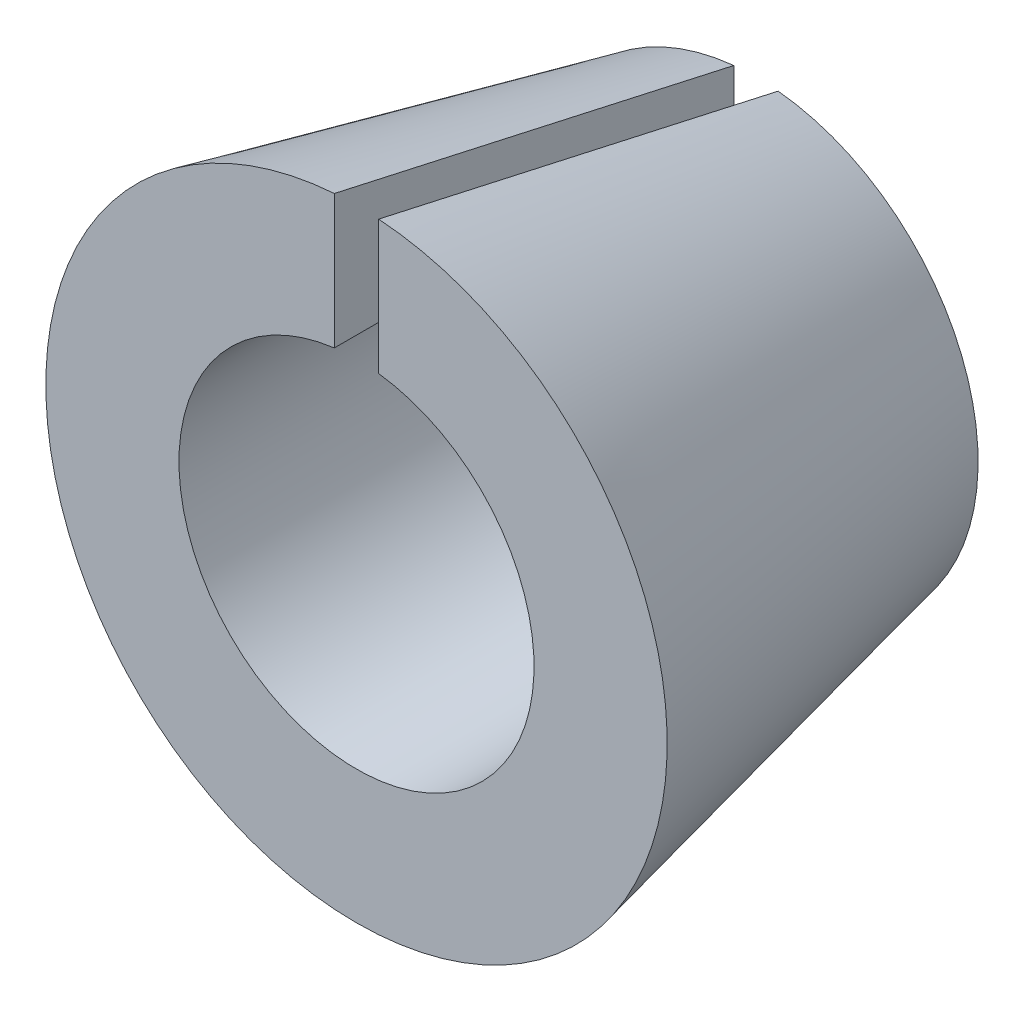
ISO-10303-21;
HEADER;
FILE_DESCRIPTION(('STEP AP214'),'2;1');
FILE_NAME('part.step','',(''),(''),'','','');
FILE_SCHEMA(('AUTOMOTIVE_DESIGN { 1 0 10303 214 1 1 1 1 }'));
ENDSEC;
DATA;
#1=APPLICATION_CONTEXT('core data for automotive mechanical design processes');
#2=APPLICATION_PROTOCOL_DEFINITION('international standard','automotive_design',2000,#1);
#3=PRODUCT_CONTEXT('',#1,'mechanical');
#4=PRODUCT('Part','Part','',(#3));
#5=PRODUCT_RELATED_PRODUCT_CATEGORY('part','',(#4));
#6=PRODUCT_DEFINITION_FORMATION('','',#4);
#7=PRODUCT_DEFINITION_CONTEXT('part definition',#1,'design');
#8=PRODUCT_DEFINITION('design','',#6,#7);
#9=PRODUCT_DEFINITION_SHAPE('','',#8);
#10=(LENGTH_UNIT() NAMED_UNIT(*) SI_UNIT(.MILLI.,.METRE.));
#11=(NAMED_UNIT(*) PLANE_ANGLE_UNIT() SI_UNIT($,.RADIAN.));
#12=(NAMED_UNIT(*) SI_UNIT($,.STERADIAN.) SOLID_ANGLE_UNIT());
#13=UNCERTAINTY_MEASURE_WITH_UNIT(LENGTH_MEASURE(1.E-05),#10,'distance_accuracy_value','');
#14=(GEOMETRIC_REPRESENTATION_CONTEXT(3) GLOBAL_UNCERTAINTY_ASSIGNED_CONTEXT((#13)) GLOBAL_UNIT_ASSIGNED_CONTEXT((#10,
#11,#12)) REPRESENTATION_CONTEXT('',''));
#15=CARTESIAN_POINT('',(0.,0.,0.));
#16=DIRECTION('',(0.,0.,1.));
#17=DIRECTION('',(1.,0.,0.));
#18=AXIS2_PLACEMENT_3D('',#15,#16,#17);
#19=CARTESIAN_POINT('',(0.,0.,0.));
#20=DIRECTION('',(0.,0.,1.));
#21=DIRECTION('',(1.,0.,0.));
#22=AXIS2_PLACEMENT_3D('',#19,#20,#21);
#23=CONICAL_SURFACE('',#22,7.,0.218166156499292);
#24=CARTESIAN_POINT('',(-0.5,3.355694424735,-16.2712981145505));
#25=CARTESIAN_POINT('',(-0.5,3.55900726503457,-15.3641098997737));
#26=CARTESIAN_POINT('',(-0.5,3.76199099777588,-14.456848047672));
#27=CARTESIAN_POINT('',(-0.5,4.16748349143125,-12.6422182853758));
#28=CARTESIAN_POINT('',(-0.5,4.36999225239251,-11.7348503751919));
#29=CARTESIAN_POINT('',(-0.5,4.79583128965445,-9.82537739598711));
#30=CARTESIAN_POINT('',(-0.5,5.01912954556605,-8.82326518911868));
#31=CARTESIAN_POINT('',(-0.5,5.55598955440432,-6.41259636553099));
#32=CARTESIAN_POINT('',(-0.5,5.86943403613145,-5.00401363368377));
#33=CARTESIAN_POINT('',(-0.500000000000001,6.49603519066776,-2.18678414407624));
#34=CARTESIAN_POINT('',(-0.500000000000001,6.80919186347156,-0.778137386314725));
#35=CARTESIAN_POINT('',(-0.500000000000001,7.79400191182409,3.65312523693342));
#36=CARTESIAN_POINT('',(-0.500000000000001,8.4653220322008,6.67581516182598));
#37=CARTESIAN_POINT('',(-0.500000000000001,9.4720068433558,11.2099154613631));
#38=CARTESIAN_POINT('',(-0.500000000000001,9.80751920370303,12.7212930616936));
#39=CARTESIAN_POINT('',(-0.500000000000002,10.4784662546327,15.7440654889765));
#40=CARTESIAN_POINT('',(-0.500000000000002,10.8139009452158,17.2554603159286));
#41=CARTESIAN_POINT('',(-0.500000000000002,11.1493071920611,18.7668614575682));
#42=B_SPLINE_CURVE_WITH_KNOTS('',3,(#24,#25,#26,#27,#28,#29,#30,#31,#32,#33,#34,#35,#36,#37,#38,
#39,#40,#41),.UNSPECIFIED.,.F.,.F.,(4,2,2,2,2,2,2,2,4),(0.,2.78907472944907,5.57814918169669,
8.65821714946361,12.9873249422436,17.3164328162138,26.6054545213391,31.2499649546581,
35.894475348537),.UNSPECIFIED.);
#43=CARTESIAN_POINT('',(-0.5,4.97970911861157,-8.99999999999999));
#44=VERTEX_POINT('',#43);
#45=CARTESIAN_POINT('',(-0.500000000000001,6.98212002188447,0.));
#46=VERTEX_POINT('',#45);
#47=EDGE_CURVE('E106',#44,#46,#42,.T.);
#48=ORIENTED_EDGE('',*,*,#47,.F.);
#49=CARTESIAN_POINT('',(0.,0.,-8.99999999999999));
#50=DIRECTION('',(0.,0.,1.));
#51=DIRECTION('',(1.,0.,0.));
#52=AXIS2_PLACEMENT_3D('',#49,#50,#51);
#53=CIRCLE('',#52,5.00474803621354);
#54=CARTESIAN_POINT('',(0.5,4.97970911861157,-8.99999999999999));
#55=VERTEX_POINT('',#54);
#56=EDGE_CURVE('E42',#44,#55,#53,.T.);
#57=ORIENTED_EDGE('',*,*,#56,.T.);
#58=CARTESIAN_POINT('',(0.5,3.355694424735,-16.2712981145505));
#59=CARTESIAN_POINT('',(0.5,3.55900726503457,-15.3641098997737));
#60=CARTESIAN_POINT('',(0.5,3.76199099777588,-14.456848047672));
#61=CARTESIAN_POINT('',(0.5,4.16748349143125,-12.6422182853758));
#62=CARTESIAN_POINT('',(0.5,4.36999225239251,-11.7348503751919));
#63=CARTESIAN_POINT('',(0.5,4.79583128965445,-9.82537739598711));
#64=CARTESIAN_POINT('',(0.5,5.01912954556605,-8.82326518911869));
#65=CARTESIAN_POINT('',(0.5,5.55598955440432,-6.412596365531));
#66=CARTESIAN_POINT('',(0.5,5.86943403613145,-5.00401363368377));
#67=CARTESIAN_POINT('',(0.499999999999999,6.49603519066776,-2.18678414407624));
#68=CARTESIAN_POINT('',(0.499999999999999,6.80919186347156,-0.778137386314726));
#69=CARTESIAN_POINT('',(0.499999999999999,7.79400191182409,3.65312523693342));
#70=CARTESIAN_POINT('',(0.499999999999999,8.4653220322008,6.67581516182598));
#71=CARTESIAN_POINT('',(0.499999999999999,9.4720068433558,11.2099154613631));
#72=CARTESIAN_POINT('',(0.499999999999999,9.80751920370303,12.7212930616936));
#73=CARTESIAN_POINT('',(0.499999999999998,10.4784662546327,15.7440654889765));
#74=CARTESIAN_POINT('',(0.499999999999998,10.8139009452158,17.2554603159286));
#75=CARTESIAN_POINT('',(0.499999999999998,11.1493071920611,18.7668614575682));
#76=B_SPLINE_CURVE_WITH_KNOTS('',3,(#58,#59,#60,#61,#62,#63,#64,#65,#66,#67,#68,#69,#70,#71,#72,
#73,#74,#75),.UNSPECIFIED.,.F.,.F.,(4,2,2,2,2,2,2,2,4),(0.,2.78907472944906,5.57814918169669,
8.65821714946361,12.9873249422436,17.3164328162138,26.6054545213391,31.2499649546581,
35.894475348537),.UNSPECIFIED.);
#77=CARTESIAN_POINT('',(0.499999999999999,6.98212002188447,0.));
#78=VERTEX_POINT('',#77);
#79=EDGE_CURVE('E82',#78,#55,#76,.F.);
#80=ORIENTED_EDGE('',*,*,#79,.F.);
#81=CARTESIAN_POINT('',(0.,0.,0.));
#82=DIRECTION('',(0.,0.,1.));
#83=DIRECTION('',(1.,0.,0.));
#84=AXIS2_PLACEMENT_3D('',#81,#82,#83);
#85=CIRCLE('',#84,7.);
#86=EDGE_CURVE('E93',#46,#78,#85,.T.);
#87=ORIENTED_EDGE('',*,*,#86,.F.);
#88=EDGE_LOOP('',(#48,#57,#80,#87));
#89=FACE_BOUND('',#88,.T.);
#90=ADVANCED_FACE('F34',(#89),#23,.T.);
#91=CARTESIAN_POINT('',(0.,0.,-8.99999999999999));
#92=DIRECTION('',(0.,0.,1.));
#93=DIRECTION('',(1.,0.,0.));
#94=AXIS2_PLACEMENT_3D('',#91,#92,#93);
#95=PLANE('',#94);
#96=ORIENTED_EDGE('',*,*,#56,.F.);
#97=DIRECTION('',(0.,-1.,0.));
#98=VECTOR('',#97,1.);
#99=CARTESIAN_POINT('',(-0.500000000000001,7.5996496692219,-8.99999999999999));
#100=LINE('',#99,#98);
#101=CARTESIAN_POINT('',(-0.5,3.96862696659689,-8.99999999999999));
#102=VERTEX_POINT('',#101);
#103=EDGE_CURVE('E55',#44,#102,#100,.T.);
#104=ORIENTED_EDGE('',*,*,#103,.T.);
#105=CARTESIAN_POINT('',(0.,0.,-8.99999999999999));
#106=DIRECTION('',(0.,0.,1.));
#107=DIRECTION('',(1.,0.,0.));
#108=AXIS2_PLACEMENT_3D('',#105,#106,#107);
#109=CIRCLE('',#108,4.);
#110=CARTESIAN_POINT('',(0.5,3.96862696659689,-8.99999999999999));
#111=VERTEX_POINT('',#110);
#112=EDGE_CURVE('E95',#102,#111,#109,.T.);
#113=ORIENTED_EDGE('',*,*,#112,.T.);
#114=DIRECTION('',(0.,1.,0.));
#115=VECTOR('',#114,1.);
#116=CARTESIAN_POINT('',(0.499999999999999,7.5996496692219,-8.99999999999999));
#117=LINE('',#116,#115);
#118=EDGE_CURVE('E80',#111,#55,#117,.T.);
#119=ORIENTED_EDGE('',*,*,#118,.T.);
#120=EDGE_LOOP('',(#96,#104,#113,#119));
#121=FACE_BOUND('',#120,.T.);
#122=ADVANCED_FACE('F121',(#121),#95,.F.);
#123=CARTESIAN_POINT('',(0.,0.,0.));
#124=DIRECTION('',(0.,0.,1.));
#125=DIRECTION('',(1.,0.,0.));
#126=AXIS2_PLACEMENT_3D('',#123,#124,#125);
#127=PLANE('',#126);
#128=DIRECTION('',(0.,-1.,0.));
#129=VECTOR('',#128,1.);
#130=CARTESIAN_POINT('',(-0.499999999999999,0.,0.));
#131=LINE('',#130,#129);
#132=CARTESIAN_POINT('',(-0.5,3.96862696659689,0.));
#133=VERTEX_POINT('',#132);
#134=EDGE_CURVE('E11',#46,#133,#131,.T.);
#135=ORIENTED_EDGE('',*,*,#134,.F.);
#136=ORIENTED_EDGE('',*,*,#86,.T.);
#137=DIRECTION('',(0.,1.,0.));
#138=VECTOR('',#137,1.);
#139=CARTESIAN_POINT('',(0.499999999999999,7.5996496692219,0.));
#140=LINE('',#139,#138);
#141=CARTESIAN_POINT('',(0.5,3.96862696659689,0.));
#142=VERTEX_POINT('',#141);
#143=EDGE_CURVE('E77',#142,#78,#140,.T.);
#144=ORIENTED_EDGE('',*,*,#143,.F.);
#145=CARTESIAN_POINT('',(0.,0.,0.));
#146=DIRECTION('',(0.,0.,1.));
#147=DIRECTION('',(1.,0.,0.));
#148=AXIS2_PLACEMENT_3D('',#145,#146,#147);
#149=CIRCLE('',#148,4.);
#150=EDGE_CURVE('E85',#133,#142,#149,.T.);
#151=ORIENTED_EDGE('',*,*,#150,.F.);
#152=EDGE_LOOP('',(#135,#136,#144,#151));
#153=FACE_BOUND('',#152,.T.);
#154=ADVANCED_FACE('F91',(#153),#127,.T.);
#155=CARTESIAN_POINT('',(-0.500000000000001,7.5996496692219,-8.99999999999999));
#156=DIRECTION('',(-1.,0.,0.));
#157=DIRECTION('',(0.,-1.,0.));
#158=AXIS2_PLACEMENT_3D('',#155,#156,#157);
#159=PLANE('',#158);
#160=ORIENTED_EDGE('',*,*,#47,.T.);
#161=ORIENTED_EDGE('',*,*,#134,.T.);
#162=DIRECTION('',(0.,0.,1.));
#163=VECTOR('',#162,1.);
#164=CARTESIAN_POINT('',(-0.5,3.96862696659689,-8.99999999999999));
#165=LINE('',#164,#163);
#166=EDGE_CURVE('E49',#102,#133,#165,.T.);
#167=ORIENTED_EDGE('',*,*,#166,.F.);
#168=ORIENTED_EDGE('',*,*,#103,.F.);
#169=EDGE_LOOP('',(#160,#161,#167,#168));
#170=FACE_BOUND('',#169,.T.);
#171=ADVANCED_FACE('F115',(#170),#159,.F.);
#172=CARTESIAN_POINT('',(0.499999999999999,7.5996496692219,-8.99999999999999));
#173=DIRECTION('',(1.,0.,0.));
#174=DIRECTION('',(0.,1.,0.));
#175=AXIS2_PLACEMENT_3D('',#172,#173,#174);
#176=PLANE('',#175);
#177=ORIENTED_EDGE('',*,*,#79,.T.);
#178=ORIENTED_EDGE('',*,*,#118,.F.);
#179=DIRECTION('',(0.,0.,1.));
#180=VECTOR('',#179,1.);
#181=CARTESIAN_POINT('',(0.5,3.96862696659689,-8.99999999999999));
#182=LINE('',#181,#180);
#183=EDGE_CURVE('E74',#111,#142,#182,.T.);
#184=ORIENTED_EDGE('',*,*,#183,.T.);
#185=ORIENTED_EDGE('',*,*,#143,.T.);
#186=EDGE_LOOP('',(#177,#178,#184,#185));
#187=FACE_BOUND('',#186,.T.);
#188=ADVANCED_FACE('F75',(#187),#176,.F.);
#189=CARTESIAN_POINT('',(0.,0.,-8.99999999999999));
#190=DIRECTION('',(0.,0.,1.));
#191=DIRECTION('',(1.,0.,0.));
#192=AXIS2_PLACEMENT_3D('',#189,#190,#191);
#193=CYLINDRICAL_SURFACE('',#192,4.);
#194=ORIENTED_EDGE('',*,*,#150,.T.);
#195=ORIENTED_EDGE('',*,*,#183,.F.);
#196=ORIENTED_EDGE('',*,*,#112,.F.);
#197=ORIENTED_EDGE('',*,*,#166,.T.);
#198=EDGE_LOOP('',(#194,#195,#196,#197));
#199=FACE_BOUND('',#198,.T.);
#200=ADVANCED_FACE('F86',(#199),#193,.F.);
#201=CLOSED_SHELL('',(#90,#122,#154,#171,#188,#200));
#202=MANIFOLD_SOLID_BREP('B2',#201);
#203=ADVANCED_BREP_SHAPE_REPRESENTATION('',(#18,#202),#14);
#204=SHAPE_DEFINITION_REPRESENTATION(#9,#203);
ENDSEC;
END-ISO-10303-21;
